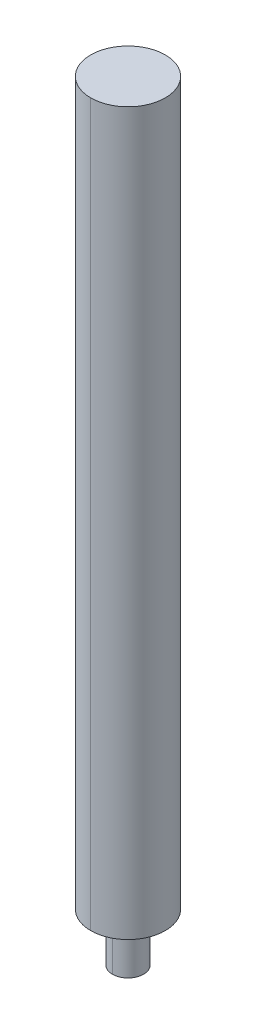
ISO-10303-21;
HEADER;
FILE_DESCRIPTION(('STEP AP214'),'2;1');
FILE_NAME('part.step','',(''),(''),'','','');
FILE_SCHEMA(('AUTOMOTIVE_DESIGN { 1 0 10303 214 1 1 1 1 }'));
ENDSEC;
DATA;
#1=APPLICATION_CONTEXT('core data for automotive mechanical design processes');
#2=APPLICATION_PROTOCOL_DEFINITION('international standard','automotive_design',2000,#1);
#3=PRODUCT_CONTEXT('',#1,'mechanical');
#4=PRODUCT('Part','Part','',(#3));
#5=PRODUCT_RELATED_PRODUCT_CATEGORY('part','',(#4));
#6=PRODUCT_DEFINITION_FORMATION('','',#4);
#7=PRODUCT_DEFINITION_CONTEXT('part definition',#1,'design');
#8=PRODUCT_DEFINITION('design','',#6,#7);
#9=PRODUCT_DEFINITION_SHAPE('','',#8);
#10=(LENGTH_UNIT() NAMED_UNIT(*) SI_UNIT(.MILLI.,.METRE.));
#11=(NAMED_UNIT(*) PLANE_ANGLE_UNIT() SI_UNIT($,.RADIAN.));
#12=(NAMED_UNIT(*) SI_UNIT($,.STERADIAN.) SOLID_ANGLE_UNIT());
#13=UNCERTAINTY_MEASURE_WITH_UNIT(LENGTH_MEASURE(1.E-05),#10,'distance_accuracy_value','');
#14=(GEOMETRIC_REPRESENTATION_CONTEXT(3) GLOBAL_UNCERTAINTY_ASSIGNED_CONTEXT((#13)) GLOBAL_UNIT_ASSIGNED_CONTEXT((#10,
#11,#12)) REPRESENTATION_CONTEXT('',''));
#15=CARTESIAN_POINT('',(0.,0.,0.));
#16=DIRECTION('',(0.,0.,1.));
#17=DIRECTION('',(1.,0.,0.));
#18=AXIS2_PLACEMENT_3D('',#15,#16,#17);
#19=CARTESIAN_POINT('',(-3.54014959719488E-11,-51.308,4.36858202590703E-11));
#20=DIRECTION('',(-1.08324950077225E-12,-1.,1.65805417833604E-12));
#21=DIRECTION('',(-1.,1.08324950077225E-12,0.));
#22=AXIS2_PLACEMENT_3D('',#19,#20,#21);
#23=PLANE('',#22);
#24=CARTESIAN_POINT('',(0.,-51.308,0.));
#25=DIRECTION('',(-1.08324950077225E-12,-1.,1.65802158999631E-12));
#26=DIRECTION('',(0.,-1.65802158999631E-12,-1.));
#27=AXIS2_PLACEMENT_3D('',#24,#25,#26);
#28=CIRCLE('',#27,16.5100000000452);
#29=CARTESIAN_POINT('',(0.,-51.3079999999727,16.5100000000452));
#30=VERTEX_POINT('',#29);
#31=CARTESIAN_POINT('',(0.,-51.3080000000274,-16.5100000000452));
#32=VERTEX_POINT('',#31);
#33=EDGE_CURVE('E11',#30,#32,#28,.T.);
#34=ORIENTED_EDGE('',*,*,#33,.T.);
#35=CARTESIAN_POINT('',(0.,-51.308,0.));
#36=DIRECTION('',(-1.08324950077225E-12,-1.,1.65802158999631E-12));
#37=DIRECTION('',(0.,-1.65802158999631E-12,-1.));
#38=AXIS2_PLACEMENT_3D('',#35,#36,#37);
#39=CIRCLE('',#38,16.5100000000452);
#40=EDGE_CURVE('E100',#32,#30,#39,.T.);
#41=ORIENTED_EDGE('',*,*,#40,.T.);
#42=EDGE_LOOP('',(#34,#41));
#43=FACE_BOUND('',#42,.T.);
#44=ADVANCED_FACE('F17',(#43),#23,.T.);
#45=CARTESIAN_POINT('',(0.,-98.0053318296876,0.));
#46=DIRECTION('',(0.,1.,0.));
#47=DIRECTION('',(0.,0.,1.));
#48=AXIS2_PLACEMENT_3D('',#45,#46,#47);
#49=CYLINDRICAL_SURFACE('',#48,16.5100000000452);
#50=DIRECTION('',(0.,1.,0.));
#51=VECTOR('',#50,1.);
#52=CARTESIAN_POINT('',(0.,-98.0053318296876,-16.5100000000452));
#53=LINE('',#52,#51);
#54=CARTESIAN_POINT('',(0.,0.,-16.5100000000452));
#55=VERTEX_POINT('',#54);
#56=EDGE_CURVE('E96',#32,#55,#53,.T.);
#57=ORIENTED_EDGE('',*,*,#56,.F.);
#58=ORIENTED_EDGE('',*,*,#33,.F.);
#59=DIRECTION('',(0.,1.,0.));
#60=VECTOR('',#59,1.);
#61=CARTESIAN_POINT('',(0.,-98.0053318296876,16.5100000000452));
#62=LINE('',#61,#60);
#63=CARTESIAN_POINT('',(0.,0.,16.5100000000452));
#64=VERTEX_POINT('',#63);
#65=EDGE_CURVE('E21',#30,#64,#62,.T.);
#66=ORIENTED_EDGE('',*,*,#65,.T.);
#67=CARTESIAN_POINT('',(0.,0.,0.));
#68=DIRECTION('',(0.,-1.,0.));
#69=DIRECTION('',(0.,0.,-1.));
#70=AXIS2_PLACEMENT_3D('',#67,#68,#69);
#71=CIRCLE('',#70,16.5100000000452);
#72=EDGE_CURVE('E28',#64,#55,#71,.T.);
#73=ORIENTED_EDGE('',*,*,#72,.T.);
#74=EDGE_LOOP('',(#57,#58,#66,#73));
#75=FACE_BOUND('',#74,.T.);
#76=ADVANCED_FACE('F126',(#75),#49,.T.);
#77=CARTESIAN_POINT('',(0.,0.,0.));
#78=DIRECTION('',(0.,1.,0.));
#79=DIRECTION('',(1.,0.,0.));
#80=AXIS2_PLACEMENT_3D('',#77,#78,#79);
#81=PLANE('',#80);
#82=ORIENTED_EDGE('',*,*,#72,.F.);
#83=CARTESIAN_POINT('',(0.,0.,0.));
#84=DIRECTION('',(0.,-1.,0.));
#85=DIRECTION('',(0.,0.,-1.));
#86=AXIS2_PLACEMENT_3D('',#83,#84,#85);
#87=CIRCLE('',#86,16.5100000000452);
#88=EDGE_CURVE('E93',#55,#64,#87,.T.);
#89=ORIENTED_EDGE('',*,*,#88,.F.);
#90=EDGE_LOOP('',(#82,#89));
#91=FACE_BOUND('',#90,.T.);
#92=CARTESIAN_POINT('',(0.,0.,0.));
#93=DIRECTION('',(0.,1.,0.));
#94=DIRECTION('',(0.,0.,1.));
#95=AXIS2_PLACEMENT_3D('',#92,#93,#94);
#96=CIRCLE('',#95,39.37);
#97=CARTESIAN_POINT('',(0.,0.,-39.37));
#98=VERTEX_POINT('',#97);
#99=CARTESIAN_POINT('',(0.,0.,39.37));
#100=VERTEX_POINT('',#99);
#101=EDGE_CURVE('E42',#98,#100,#96,.T.);
#102=ORIENTED_EDGE('',*,*,#101,.F.);
#103=CARTESIAN_POINT('',(0.,0.,0.));
#104=DIRECTION('',(0.,1.,0.));
#105=DIRECTION('',(0.,0.,1.));
#106=AXIS2_PLACEMENT_3D('',#103,#104,#105);
#107=CIRCLE('',#106,39.37);
#108=EDGE_CURVE('E83',#100,#98,#107,.T.);
#109=ORIENTED_EDGE('',*,*,#108,.F.);
#110=EDGE_LOOP('',(#102,#109));
#111=FACE_BOUND('',#110,.T.);
#112=ADVANCED_FACE('F128',(#91,#111),#81,.F.);
#113=CARTESIAN_POINT('',(0.,762.,0.));
#114=DIRECTION('',(0.,1.,0.));
#115=DIRECTION('',(1.,0.,0.));
#116=AXIS2_PLACEMENT_3D('',#113,#114,#115);
#117=PLANE('',#116);
#118=CARTESIAN_POINT('',(0.,762.,0.));
#119=DIRECTION('',(0.,1.,0.));
#120=DIRECTION('',(0.,0.,1.));
#121=AXIS2_PLACEMENT_3D('',#118,#119,#120);
#122=CIRCLE('',#121,39.37);
#123=CARTESIAN_POINT('',(0.,762.,-39.37));
#124=VERTEX_POINT('',#123);
#125=CARTESIAN_POINT('',(0.,762.,39.37));
#126=VERTEX_POINT('',#125);
#127=EDGE_CURVE('E68',#124,#126,#122,.T.);
#128=ORIENTED_EDGE('',*,*,#127,.T.);
#129=CARTESIAN_POINT('',(0.,762.,0.));
#130=DIRECTION('',(0.,1.,0.));
#131=DIRECTION('',(0.,0.,1.));
#132=AXIS2_PLACEMENT_3D('',#129,#130,#131);
#133=CIRCLE('',#132,39.37);
#134=EDGE_CURVE('E71',#126,#124,#133,.T.);
#135=ORIENTED_EDGE('',*,*,#134,.T.);
#136=EDGE_LOOP('',(#128,#135));
#137=FACE_BOUND('',#136,.T.);
#138=ADVANCED_FACE('F19',(#137),#117,.T.);
#139=CARTESIAN_POINT('',(0.,762.,0.));
#140=DIRECTION('',(0.,-1.,0.));
#141=DIRECTION('',(0.,0.,-1.));
#142=AXIS2_PLACEMENT_3D('',#139,#140,#141);
#143=CYLINDRICAL_SURFACE('',#142,39.37);
#144=DIRECTION('',(0.,-1.,0.));
#145=VECTOR('',#144,1.);
#146=CARTESIAN_POINT('',(0.,762.,39.37));
#147=LINE('',#146,#145);
#148=EDGE_CURVE('E78',#126,#100,#147,.T.);
#149=ORIENTED_EDGE('',*,*,#148,.F.);
#150=ORIENTED_EDGE('',*,*,#127,.F.);
#151=DIRECTION('',(0.,-1.,0.));
#152=VECTOR('',#151,1.);
#153=CARTESIAN_POINT('',(0.,762.,-39.37));
#154=LINE('',#153,#152);
#155=EDGE_CURVE('E75',#124,#98,#154,.T.);
#156=ORIENTED_EDGE('',*,*,#155,.T.);
#157=ORIENTED_EDGE('',*,*,#101,.T.);
#158=EDGE_LOOP('',(#149,#150,#156,#157));
#159=FACE_BOUND('',#158,.T.);
#160=ADVANCED_FACE('F79',(#159),#143,.T.);
#161=CARTESIAN_POINT('',(0.,762.,0.));
#162=DIRECTION('',(0.,-1.,0.));
#163=DIRECTION('',(0.,0.,-1.));
#164=AXIS2_PLACEMENT_3D('',#161,#162,#163);
#165=CYLINDRICAL_SURFACE('',#164,39.37);
#166=ORIENTED_EDGE('',*,*,#134,.F.);
#167=ORIENTED_EDGE('',*,*,#148,.T.);
#168=ORIENTED_EDGE('',*,*,#108,.T.);
#169=ORIENTED_EDGE('',*,*,#155,.F.);
#170=EDGE_LOOP('',(#166,#167,#168,#169));
#171=FACE_BOUND('',#170,.T.);
#172=ADVANCED_FACE('F85',(#171),#165,.T.);
#173=CARTESIAN_POINT('',(0.,-98.0053318296876,0.));
#174=DIRECTION('',(0.,1.,0.));
#175=DIRECTION('',(0.,0.,1.));
#176=AXIS2_PLACEMENT_3D('',#173,#174,#175);
#177=CYLINDRICAL_SURFACE('',#176,16.5100000000452);
#178=ORIENTED_EDGE('',*,*,#40,.F.);
#179=ORIENTED_EDGE('',*,*,#56,.T.);
#180=ORIENTED_EDGE('',*,*,#88,.T.);
#181=ORIENTED_EDGE('',*,*,#65,.F.);
#182=EDGE_LOOP('',(#178,#179,#180,#181));
#183=FACE_BOUND('',#182,.T.);
#184=ADVANCED_FACE('F123',(#183),#177,.T.);
#185=CLOSED_SHELL('',(#44,#76,#112,#138,#160,#172,#184));
#186=MANIFOLD_SOLID_BREP('B1',#185);
#187=ADVANCED_BREP_SHAPE_REPRESENTATION('',(#18,#186),#14);
#188=SHAPE_DEFINITION_REPRESENTATION(#9,#187);
ENDSEC;
END-ISO-10303-21;
